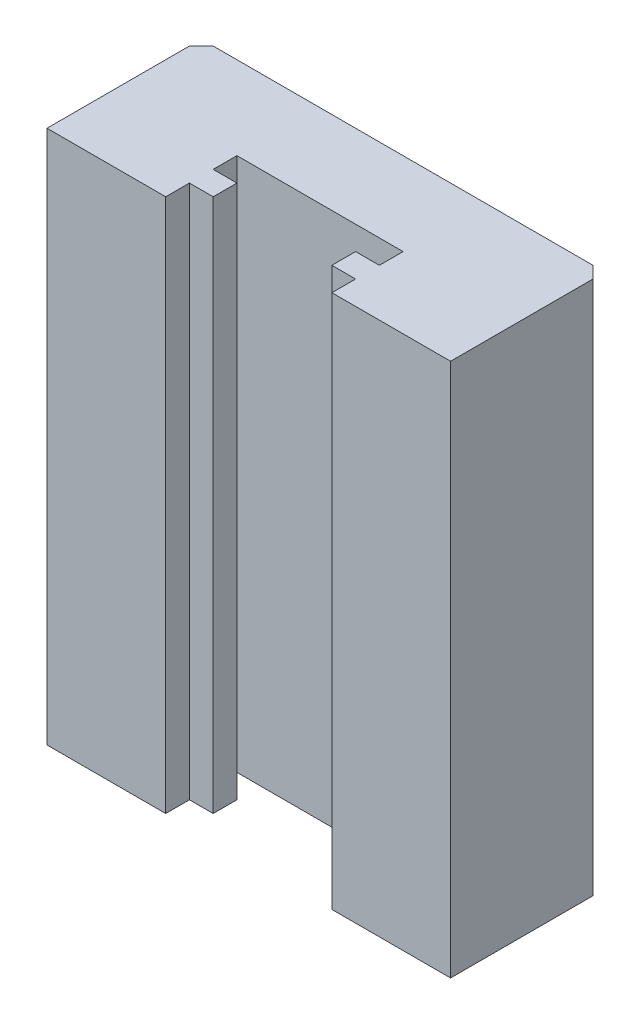
ISO-10303-21;
HEADER;
FILE_DESCRIPTION(('STEP AP214'),'2;1');
FILE_NAME('part.step','',(''),(''),'','','');
FILE_SCHEMA(('AUTOMOTIVE_DESIGN { 1 0 10303 214 1 1 1 1 }'));
ENDSEC;
DATA;
#1=APPLICATION_CONTEXT('core data for automotive mechanical design processes');
#2=APPLICATION_PROTOCOL_DEFINITION('international standard','automotive_design',2000,#1);
#3=PRODUCT_CONTEXT('',#1,'mechanical');
#4=PRODUCT('Part','Part','',(#3));
#5=PRODUCT_RELATED_PRODUCT_CATEGORY('part','',(#4));
#6=PRODUCT_DEFINITION_FORMATION('','',#4);
#7=PRODUCT_DEFINITION_CONTEXT('part definition',#1,'design');
#8=PRODUCT_DEFINITION('design','',#6,#7);
#9=PRODUCT_DEFINITION_SHAPE('','',#8);
#10=(LENGTH_UNIT() NAMED_UNIT(*) SI_UNIT(.MILLI.,.METRE.));
#11=(NAMED_UNIT(*) PLANE_ANGLE_UNIT() SI_UNIT($,.RADIAN.));
#12=(NAMED_UNIT(*) SI_UNIT($,.STERADIAN.) SOLID_ANGLE_UNIT());
#13=UNCERTAINTY_MEASURE_WITH_UNIT(LENGTH_MEASURE(1.E-05),#10,'distance_accuracy_value','');
#14=(GEOMETRIC_REPRESENTATION_CONTEXT(3) GLOBAL_UNCERTAINTY_ASSIGNED_CONTEXT((#13)) GLOBAL_UNIT_ASSIGNED_CONTEXT((#10,
#11,#12)) REPRESENTATION_CONTEXT('',''));
#15=CARTESIAN_POINT('',(0.,0.,0.));
#16=DIRECTION('',(0.,0.,1.));
#17=DIRECTION('',(1.,0.,0.));
#18=AXIS2_PLACEMENT_3D('',#15,#16,#17);
#19=CARTESIAN_POINT('',(0.,22.5,3.25));
#20=DIRECTION('',(0.,0.,-1.));
#21=DIRECTION('',(-1.,0.,0.));
#22=AXIS2_PLACEMENT_3D('',#19,#20,#21);
#23=PLANE('',#22);
#24=DIRECTION('',(1.,0.,0.));
#25=VECTOR('',#24,1.);
#26=CARTESIAN_POINT('',(0.,0.,3.25));
#27=LINE('',#26,#25);
#28=CARTESIAN_POINT('',(-8.5,0.,3.25));
#29=VERTEX_POINT('',#28);
#30=CARTESIAN_POINT('',(-3.5,0.,3.25));
#31=VERTEX_POINT('',#30);
#32=EDGE_CURVE('E195',#29,#31,#27,.T.);
#33=ORIENTED_EDGE('',*,*,#32,.T.);
#34=DIRECTION('',(0.,-1.,0.));
#35=VECTOR('',#34,1.);
#36=CARTESIAN_POINT('',(-3.5,22.5,3.25));
#37=LINE('',#36,#35);
#38=CARTESIAN_POINT('',(-3.5,22.5,3.25));
#39=VERTEX_POINT('',#38);
#40=EDGE_CURVE('E179',#39,#31,#37,.T.);
#41=ORIENTED_EDGE('',*,*,#40,.F.);
#42=DIRECTION('',(1.,0.,0.));
#43=VECTOR('',#42,1.);
#44=CARTESIAN_POINT('',(0.,22.5,3.25));
#45=LINE('',#44,#43);
#46=CARTESIAN_POINT('',(-8.5,22.5,3.25));
#47=VERTEX_POINT('',#46);
#48=EDGE_CURVE('E185',#47,#39,#45,.T.);
#49=ORIENTED_EDGE('',*,*,#48,.F.);
#50=DIRECTION('',(0.,-1.,0.));
#51=VECTOR('',#50,1.);
#52=CARTESIAN_POINT('',(-8.5,22.5,3.25));
#53=LINE('',#52,#51);
#54=EDGE_CURVE('E244',#47,#29,#53,.T.);
#55=ORIENTED_EDGE('',*,*,#54,.T.);
#56=EDGE_LOOP('',(#33,#41,#49,#55));
#57=FACE_BOUND('',#56,.T.);
#58=ADVANCED_FACE('F45',(#57),#23,.F.);
#59=CARTESIAN_POINT('',(-3.5,22.5,0.));
#60=DIRECTION('',(-1.,0.,0.));
#61=DIRECTION('',(0.,0.,1.));
#62=AXIS2_PLACEMENT_3D('',#59,#60,#61);
#63=PLANE('',#62);
#64=DIRECTION('',(0.,0.,-1.));
#65=VECTOR('',#64,1.);
#66=CARTESIAN_POINT('',(-3.5,0.,0.));
#67=LINE('',#66,#65);
#68=CARTESIAN_POINT('',(-3.5,0.,2.25));
#69=VERTEX_POINT('',#68);
#70=EDGE_CURVE('E284',#31,#69,#67,.T.);
#71=ORIENTED_EDGE('',*,*,#70,.T.);
#72=DIRECTION('',(0.,-1.,0.));
#73=VECTOR('',#72,1.);
#74=CARTESIAN_POINT('',(-3.5,22.5,2.25));
#75=LINE('',#74,#73);
#76=CARTESIAN_POINT('',(-3.5,22.5,2.25));
#77=VERTEX_POINT('',#76);
#78=EDGE_CURVE('E182',#77,#69,#75,.T.);
#79=ORIENTED_EDGE('',*,*,#78,.F.);
#80=DIRECTION('',(0.,0.,-1.));
#81=VECTOR('',#80,1.);
#82=CARTESIAN_POINT('',(-3.5,22.5,0.));
#83=LINE('',#82,#81);
#84=EDGE_CURVE('E175',#39,#77,#83,.T.);
#85=ORIENTED_EDGE('',*,*,#84,.F.);
#86=ORIENTED_EDGE('',*,*,#40,.T.);
#87=EDGE_LOOP('',(#71,#79,#85,#86));
#88=FACE_BOUND('',#87,.T.);
#89=ADVANCED_FACE('F177',(#88),#63,.F.);
#90=CARTESIAN_POINT('',(0.,22.5,2.25));
#91=DIRECTION('',(0.,0.,-1.));
#92=DIRECTION('',(-1.,0.,0.));
#93=AXIS2_PLACEMENT_3D('',#90,#91,#92);
#94=PLANE('',#93);
#95=DIRECTION('',(1.,0.,0.));
#96=VECTOR('',#95,1.);
#97=CARTESIAN_POINT('',(0.,0.,2.25));
#98=LINE('',#97,#96);
#99=CARTESIAN_POINT('',(-2.5,0.,2.25));
#100=VERTEX_POINT('',#99);
#101=EDGE_CURVE('E278',#69,#100,#98,.T.);
#102=ORIENTED_EDGE('',*,*,#101,.T.);
#103=DIRECTION('',(0.,-1.,0.));
#104=VECTOR('',#103,1.);
#105=CARTESIAN_POINT('',(-2.5,22.5,2.25));
#106=LINE('',#105,#104);
#107=CARTESIAN_POINT('',(-2.5,22.5,2.25));
#108=VERTEX_POINT('',#107);
#109=EDGE_CURVE('E200',#108,#100,#106,.T.);
#110=ORIENTED_EDGE('',*,*,#109,.F.);
#111=DIRECTION('',(1.,0.,0.));
#112=VECTOR('',#111,1.);
#113=CARTESIAN_POINT('',(0.,22.5,2.25));
#114=LINE('',#113,#112);
#115=EDGE_CURVE('E184',#77,#108,#114,.T.);
#116=ORIENTED_EDGE('',*,*,#115,.F.);
#117=ORIENTED_EDGE('',*,*,#78,.T.);
#118=EDGE_LOOP('',(#102,#110,#116,#117));
#119=FACE_BOUND('',#118,.T.);
#120=ADVANCED_FACE('F364',(#119),#94,.F.);
#121=CARTESIAN_POINT('',(-2.5,22.5,0.));
#122=DIRECTION('',(-1.,0.,0.));
#123=DIRECTION('',(0.,0.,1.));
#124=AXIS2_PLACEMENT_3D('',#121,#122,#123);
#125=PLANE('',#124);
#126=DIRECTION('',(0.,0.,-1.));
#127=VECTOR('',#126,1.);
#128=CARTESIAN_POINT('',(-2.5,0.,0.));
#129=LINE('',#128,#127);
#130=CARTESIAN_POINT('',(-2.5,0.,1.25));
#131=VERTEX_POINT('',#130);
#132=EDGE_CURVE('E273',#100,#131,#129,.T.);
#133=ORIENTED_EDGE('',*,*,#132,.T.);
#134=DIRECTION('',(0.,-1.,0.));
#135=VECTOR('',#134,1.);
#136=CARTESIAN_POINT('',(-2.5,22.5,1.25));
#137=LINE('',#136,#135);
#138=CARTESIAN_POINT('',(-2.5,22.5,1.25));
#139=VERTEX_POINT('',#138);
#140=EDGE_CURVE('E264',#139,#131,#137,.T.);
#141=ORIENTED_EDGE('',*,*,#140,.F.);
#142=DIRECTION('',(0.,0.,-1.));
#143=VECTOR('',#142,1.);
#144=CARTESIAN_POINT('',(-2.5,22.5,0.));
#145=LINE('',#144,#143);
#146=EDGE_CURVE('E274',#108,#139,#145,.T.);
#147=ORIENTED_EDGE('',*,*,#146,.F.);
#148=ORIENTED_EDGE('',*,*,#109,.T.);
#149=EDGE_LOOP('',(#133,#141,#147,#148));
#150=FACE_BOUND('',#149,.T.);
#151=ADVANCED_FACE('F271',(#150),#125,.F.);
#152=CARTESIAN_POINT('',(0.,22.5,1.25));
#153=DIRECTION('',(0.,0.,1.));
#154=DIRECTION('',(1.,0.,0.));
#155=AXIS2_PLACEMENT_3D('',#152,#153,#154);
#156=PLANE('',#155);
#157=DIRECTION('',(-1.,0.,0.));
#158=VECTOR('',#157,1.);
#159=CARTESIAN_POINT('',(0.,0.,1.25));
#160=LINE('',#159,#158);
#161=CARTESIAN_POINT('',(-3.5,0.,1.25));
#162=VERTEX_POINT('',#161);
#163=EDGE_CURVE('E280',#131,#162,#160,.T.);
#164=ORIENTED_EDGE('',*,*,#163,.T.);
#165=DIRECTION('',(0.,-1.,0.));
#166=VECTOR('',#165,1.);
#167=CARTESIAN_POINT('',(-3.5,22.5,1.25));
#168=LINE('',#167,#166);
#169=CARTESIAN_POINT('',(-3.5,22.5,1.25));
#170=VERTEX_POINT('',#169);
#171=EDGE_CURVE('E261',#170,#162,#168,.T.);
#172=ORIENTED_EDGE('',*,*,#171,.F.);
#173=DIRECTION('',(-1.,0.,0.));
#174=VECTOR('',#173,1.);
#175=CARTESIAN_POINT('',(0.,22.5,1.25));
#176=LINE('',#175,#174);
#177=EDGE_CURVE('E348',#139,#170,#176,.T.);
#178=ORIENTED_EDGE('',*,*,#177,.F.);
#179=ORIENTED_EDGE('',*,*,#140,.T.);
#180=EDGE_LOOP('',(#164,#172,#178,#179));
#181=FACE_BOUND('',#180,.T.);
#182=ADVANCED_FACE('F347',(#181),#156,.F.);
#183=CARTESIAN_POINT('',(-3.5,22.5,0.));
#184=DIRECTION('',(-1.,0.,0.));
#185=DIRECTION('',(0.,0.,1.));
#186=AXIS2_PLACEMENT_3D('',#183,#184,#185);
#187=PLANE('',#186);
#188=DIRECTION('',(0.,0.,-1.));
#189=VECTOR('',#188,1.);
#190=CARTESIAN_POINT('',(-3.5,0.,0.));
#191=LINE('',#190,#189);
#192=CARTESIAN_POINT('',(-3.5,0.,0.25));
#193=VERTEX_POINT('',#192);
#194=EDGE_CURVE('E282',#162,#193,#191,.T.);
#195=ORIENTED_EDGE('',*,*,#194,.T.);
#196=DIRECTION('',(0.,-1.,0.));
#197=VECTOR('',#196,1.);
#198=CARTESIAN_POINT('',(-3.5,22.5,0.25));
#199=LINE('',#198,#197);
#200=CARTESIAN_POINT('',(-3.5,22.5,0.25));
#201=VERTEX_POINT('',#200);
#202=EDGE_CURVE('E259',#201,#193,#199,.T.);
#203=ORIENTED_EDGE('',*,*,#202,.F.);
#204=DIRECTION('',(0.,0.,-1.));
#205=VECTOR('',#204,1.);
#206=CARTESIAN_POINT('',(-3.5,22.5,0.));
#207=LINE('',#206,#205);
#208=EDGE_CURVE('E344',#170,#201,#207,.T.);
#209=ORIENTED_EDGE('',*,*,#208,.F.);
#210=ORIENTED_EDGE('',*,*,#171,.T.);
#211=EDGE_LOOP('',(#195,#203,#209,#210));
#212=FACE_BOUND('',#211,.T.);
#213=ADVANCED_FACE('F341',(#212),#187,.F.);
#214=CARTESIAN_POINT('',(0.,22.5,0.25));
#215=DIRECTION('',(0.,0.,1.));
#216=DIRECTION('',(1.,0.,0.));
#217=AXIS2_PLACEMENT_3D('',#214,#215,#216);
#218=PLANE('',#217);
#219=DIRECTION('',(-1.,0.,0.));
#220=VECTOR('',#219,1.);
#221=CARTESIAN_POINT('',(0.,0.,0.25));
#222=LINE('',#221,#220);
#223=CARTESIAN_POINT('',(3.5,0.,0.25));
#224=VERTEX_POINT('',#223);
#225=EDGE_CURVE('E290',#224,#193,#222,.T.);
#226=ORIENTED_EDGE('',*,*,#225,.F.);
#227=DIRECTION('',(0.,-1.,0.));
#228=VECTOR('',#227,1.);
#229=CARTESIAN_POINT('',(3.5,22.5,0.25));
#230=LINE('',#229,#228);
#231=CARTESIAN_POINT('',(3.5,22.5,0.25));
#232=VERTEX_POINT('',#231);
#233=EDGE_CURVE('E257',#232,#224,#230,.T.);
#234=ORIENTED_EDGE('',*,*,#233,.F.);
#235=DIRECTION('',(-1.,0.,0.));
#236=VECTOR('',#235,1.);
#237=CARTESIAN_POINT('',(0.,22.5,0.25));
#238=LINE('',#237,#236);
#239=EDGE_CURVE('E350',#232,#201,#238,.T.);
#240=ORIENTED_EDGE('',*,*,#239,.T.);
#241=ORIENTED_EDGE('',*,*,#202,.T.);
#242=EDGE_LOOP('',(#226,#234,#240,#241));
#243=FACE_BOUND('',#242,.T.);
#244=ADVANCED_FACE('F338',(#243),#218,.T.);
#245=CARTESIAN_POINT('',(3.5,22.5,0.));
#246=DIRECTION('',(-1.,0.,0.));
#247=DIRECTION('',(0.,0.,1.));
#248=AXIS2_PLACEMENT_3D('',#245,#246,#247);
#249=PLANE('',#248);
#250=DIRECTION('',(0.,0.,-1.));
#251=VECTOR('',#250,1.);
#252=CARTESIAN_POINT('',(3.5,0.,0.));
#253=LINE('',#252,#251);
#254=CARTESIAN_POINT('',(3.5,0.,1.25));
#255=VERTEX_POINT('',#254);
#256=EDGE_CURVE('E293',#255,#224,#253,.T.);
#257=ORIENTED_EDGE('',*,*,#256,.F.);
#258=DIRECTION('',(0.,-1.,0.));
#259=VECTOR('',#258,1.);
#260=CARTESIAN_POINT('',(3.5,22.5,1.25));
#261=LINE('',#260,#259);
#262=CARTESIAN_POINT('',(3.5,22.5,1.25));
#263=VERTEX_POINT('',#262);
#264=EDGE_CURVE('E255',#263,#255,#261,.T.);
#265=ORIENTED_EDGE('',*,*,#264,.F.);
#266=DIRECTION('',(0.,0.,-1.));
#267=VECTOR('',#266,1.);
#268=CARTESIAN_POINT('',(3.5,22.5,0.));
#269=LINE('',#268,#267);
#270=EDGE_CURVE('E334',#263,#232,#269,.T.);
#271=ORIENTED_EDGE('',*,*,#270,.T.);
#272=ORIENTED_EDGE('',*,*,#233,.T.);
#273=EDGE_LOOP('',(#257,#265,#271,#272));
#274=FACE_BOUND('',#273,.T.);
#275=ADVANCED_FACE('F332',(#274),#249,.T.);
#276=CARTESIAN_POINT('',(0.,22.5,1.25));
#277=DIRECTION('',(0.,0.,-1.));
#278=DIRECTION('',(-1.,0.,0.));
#279=AXIS2_PLACEMENT_3D('',#276,#277,#278);
#280=PLANE('',#279);
#281=DIRECTION('',(1.,0.,0.));
#282=VECTOR('',#281,1.);
#283=CARTESIAN_POINT('',(0.,0.,1.25));
#284=LINE('',#283,#282);
#285=CARTESIAN_POINT('',(2.5,0.,1.25));
#286=VERTEX_POINT('',#285);
#287=EDGE_CURVE('E296',#286,#255,#284,.T.);
#288=ORIENTED_EDGE('',*,*,#287,.F.);
#289=DIRECTION('',(0.,-1.,0.));
#290=VECTOR('',#289,1.);
#291=CARTESIAN_POINT('',(2.5,22.5,1.25));
#292=LINE('',#291,#290);
#293=CARTESIAN_POINT('',(2.5,22.5,1.25));
#294=VERTEX_POINT('',#293);
#295=EDGE_CURVE('E253',#294,#286,#292,.T.);
#296=ORIENTED_EDGE('',*,*,#295,.F.);
#297=DIRECTION('',(1.,0.,0.));
#298=VECTOR('',#297,1.);
#299=CARTESIAN_POINT('',(0.,22.5,1.25));
#300=LINE('',#299,#298);
#301=EDGE_CURVE('E328',#294,#263,#300,.T.);
#302=ORIENTED_EDGE('',*,*,#301,.T.);
#303=ORIENTED_EDGE('',*,*,#264,.T.);
#304=EDGE_LOOP('',(#288,#296,#302,#303));
#305=FACE_BOUND('',#304,.T.);
#306=ADVANCED_FACE('F325',(#305),#280,.T.);
#307=CARTESIAN_POINT('',(2.5,22.5,0.));
#308=DIRECTION('',(-1.,0.,0.));
#309=DIRECTION('',(0.,0.,1.));
#310=AXIS2_PLACEMENT_3D('',#307,#308,#309);
#311=PLANE('',#310);
#312=DIRECTION('',(0.,0.,-1.));
#313=VECTOR('',#312,1.);
#314=CARTESIAN_POINT('',(2.5,0.,0.));
#315=LINE('',#314,#313);
#316=CARTESIAN_POINT('',(2.5,0.,2.25));
#317=VERTEX_POINT('',#316);
#318=EDGE_CURVE('E299',#317,#286,#315,.T.);
#319=ORIENTED_EDGE('',*,*,#318,.F.);
#320=DIRECTION('',(0.,-1.,0.));
#321=VECTOR('',#320,1.);
#322=CARTESIAN_POINT('',(2.5,22.5,2.25));
#323=LINE('',#322,#321);
#324=CARTESIAN_POINT('',(2.5,22.5,2.25));
#325=VERTEX_POINT('',#324);
#326=EDGE_CURVE('E251',#325,#317,#323,.T.);
#327=ORIENTED_EDGE('',*,*,#326,.F.);
#328=DIRECTION('',(0.,0.,-1.));
#329=VECTOR('',#328,1.);
#330=CARTESIAN_POINT('',(2.5,22.5,0.));
#331=LINE('',#330,#329);
#332=EDGE_CURVE('E358',#325,#294,#331,.T.);
#333=ORIENTED_EDGE('',*,*,#332,.T.);
#334=ORIENTED_EDGE('',*,*,#295,.T.);
#335=EDGE_LOOP('',(#319,#327,#333,#334));
#336=FACE_BOUND('',#335,.T.);
#337=ADVANCED_FACE('F321',(#336),#311,.T.);
#338=CARTESIAN_POINT('',(0.,22.5,2.25));
#339=DIRECTION('',(0.,0.,1.));
#340=DIRECTION('',(1.,0.,0.));
#341=AXIS2_PLACEMENT_3D('',#338,#339,#340);
#342=PLANE('',#341);
#343=DIRECTION('',(-1.,0.,0.));
#344=VECTOR('',#343,1.);
#345=CARTESIAN_POINT('',(0.,0.,2.25));
#346=LINE('',#345,#344);
#347=CARTESIAN_POINT('',(3.5,0.,2.25));
#348=VERTEX_POINT('',#347);
#349=EDGE_CURVE('E301',#348,#317,#346,.T.);
#350=ORIENTED_EDGE('',*,*,#349,.F.);
#351=DIRECTION('',(0.,-1.,0.));
#352=VECTOR('',#351,1.);
#353=CARTESIAN_POINT('',(3.5,22.5,2.25));
#354=LINE('',#353,#352);
#355=CARTESIAN_POINT('',(3.5,22.5,2.25));
#356=VERTEX_POINT('',#355);
#357=EDGE_CURVE('E249',#356,#348,#354,.T.);
#358=ORIENTED_EDGE('',*,*,#357,.F.);
#359=DIRECTION('',(-1.,0.,0.));
#360=VECTOR('',#359,1.);
#361=CARTESIAN_POINT('',(0.,22.5,2.25));
#362=LINE('',#361,#360);
#363=EDGE_CURVE('E317',#356,#325,#362,.T.);
#364=ORIENTED_EDGE('',*,*,#363,.T.);
#365=ORIENTED_EDGE('',*,*,#326,.T.);
#366=EDGE_LOOP('',(#350,#358,#364,#365));
#367=FACE_BOUND('',#366,.T.);
#368=ADVANCED_FACE('F315',(#367),#342,.T.);
#369=CARTESIAN_POINT('',(3.5,22.5,0.));
#370=DIRECTION('',(-1.,0.,0.));
#371=DIRECTION('',(0.,0.,1.));
#372=AXIS2_PLACEMENT_3D('',#369,#370,#371);
#373=PLANE('',#372);
#374=DIRECTION('',(0.,0.,-1.));
#375=VECTOR('',#374,1.);
#376=CARTESIAN_POINT('',(3.5,0.,0.));
#377=LINE('',#376,#375);
#378=CARTESIAN_POINT('',(3.5,0.,3.25));
#379=VERTEX_POINT('',#378);
#380=EDGE_CURVE('E237',#379,#348,#377,.T.);
#381=ORIENTED_EDGE('',*,*,#380,.F.);
#382=DIRECTION('',(0.,-1.,0.));
#383=VECTOR('',#382,1.);
#384=CARTESIAN_POINT('',(3.5,22.5,3.25));
#385=LINE('',#384,#383);
#386=CARTESIAN_POINT('',(3.5,22.5,3.25));
#387=VERTEX_POINT('',#386);
#388=EDGE_CURVE('E247',#387,#379,#385,.T.);
#389=ORIENTED_EDGE('',*,*,#388,.F.);
#390=DIRECTION('',(0.,0.,-1.));
#391=VECTOR('',#390,1.);
#392=CARTESIAN_POINT('',(3.5,22.5,0.));
#393=LINE('',#392,#391);
#394=EDGE_CURVE('E311',#387,#356,#393,.T.);
#395=ORIENTED_EDGE('',*,*,#394,.T.);
#396=ORIENTED_EDGE('',*,*,#357,.T.);
#397=EDGE_LOOP('',(#381,#389,#395,#396));
#398=FACE_BOUND('',#397,.T.);
#399=ADVANCED_FACE('F307',(#398),#373,.T.);
#400=CARTESIAN_POINT('',(8.5,0.,3.25));
#401=VERTEX_POINT('',#400);
#402=EDGE_CURVE('E234',#379,#401,#27,.T.);
#403=ORIENTED_EDGE('',*,*,#402,.T.);
#404=DIRECTION('',(0.,-1.,0.));
#405=VECTOR('',#404,1.);
#406=CARTESIAN_POINT('',(8.5,22.5,3.25));
#407=LINE('',#406,#405);
#408=CARTESIAN_POINT('',(8.5,22.5,3.25));
#409=VERTEX_POINT('',#408);
#410=EDGE_CURVE('E233',#409,#401,#407,.T.);
#411=ORIENTED_EDGE('',*,*,#410,.F.);
#412=EDGE_CURVE('E193',#387,#409,#45,.T.);
#413=ORIENTED_EDGE('',*,*,#412,.F.);
#414=ORIENTED_EDGE('',*,*,#388,.T.);
#415=EDGE_LOOP('',(#403,#411,#413,#414));
#416=FACE_BOUND('',#415,.T.);
#417=ADVANCED_FACE('F416',(#416),#23,.F.);
#418=CARTESIAN_POINT('',(8.5,22.5,0.));
#419=DIRECTION('',(-1.,0.,0.));
#420=DIRECTION('',(0.,0.,1.));
#421=AXIS2_PLACEMENT_3D('',#418,#419,#420);
#422=PLANE('',#421);
#423=DIRECTION('',(0.,0.,-1.));
#424=VECTOR('',#423,1.);
#425=CARTESIAN_POINT('',(8.5,0.,0.));
#426=LINE('',#425,#424);
#427=CARTESIAN_POINT('',(8.5,0.,-2.75));
#428=VERTEX_POINT('',#427);
#429=EDGE_CURVE('E228',#401,#428,#426,.T.);
#430=ORIENTED_EDGE('',*,*,#429,.T.);
#431=DIRECTION('',(0.,1.,0.));
#432=VECTOR('',#431,1.);
#433=CARTESIAN_POINT('',(8.5,22.5,-2.75));
#434=LINE('',#433,#432);
#435=CARTESIAN_POINT('',(8.5,22.5,-2.75));
#436=VERTEX_POINT('',#435);
#437=EDGE_CURVE('E69',#428,#436,#434,.T.);
#438=ORIENTED_EDGE('',*,*,#437,.T.);
#439=DIRECTION('',(0.,0.,-1.));
#440=VECTOR('',#439,1.);
#441=CARTESIAN_POINT('',(8.5,22.5,0.));
#442=LINE('',#441,#440);
#443=EDGE_CURVE('E214',#409,#436,#442,.T.);
#444=ORIENTED_EDGE('',*,*,#443,.F.);
#445=ORIENTED_EDGE('',*,*,#410,.T.);
#446=EDGE_LOOP('',(#430,#438,#444,#445));
#447=FACE_BOUND('',#446,.T.);
#448=ADVANCED_FACE('F231',(#447),#422,.F.);
#449=CARTESIAN_POINT('',(0.,22.5,-3.25));
#450=DIRECTION('',(0.,0.,-1.));
#451=DIRECTION('',(-1.,0.,0.));
#452=AXIS2_PLACEMENT_3D('',#449,#450,#451);
#453=PLANE('',#452);
#454=CARTESIAN_POINT('',(6.,15.25,-3.25));
#455=DIRECTION('',(0.,0.,-1.));
#456=DIRECTION('',(1.,0.,0.));
#457=AXIS2_PLACEMENT_3D('',#454,#455,#456);
#458=CIRCLE('',#457,1.);
#459=CARTESIAN_POINT('',(7.,15.25,-3.25));
#460=VERTEX_POINT('',#459);
#461=EDGE_CURVE('E375',#460,#460,#458,.T.);
#462=ORIENTED_EDGE('',*,*,#461,.F.);
#463=EDGE_LOOP('',(#462));
#464=FACE_BOUND('',#463,.T.);
#465=CARTESIAN_POINT('',(6.,7.25,-3.25));
#466=DIRECTION('',(0.,0.,-1.));
#467=DIRECTION('',(-1.,0.,0.));
#468=AXIS2_PLACEMENT_3D('',#465,#466,#467);
#469=CIRCLE('',#468,1.);
#470=CARTESIAN_POINT('',(5.,7.25,-3.25));
#471=VERTEX_POINT('',#470);
#472=EDGE_CURVE('E381',#471,#471,#469,.T.);
#473=ORIENTED_EDGE('',*,*,#472,.F.);
#474=EDGE_LOOP('',(#473));
#475=FACE_BOUND('',#474,.T.);
#476=CARTESIAN_POINT('',(-6.,7.25,-3.25));
#477=DIRECTION('',(0.,0.,-1.));
#478=DIRECTION('',(1.,0.,0.));
#479=AXIS2_PLACEMENT_3D('',#476,#477,#478);
#480=CIRCLE('',#479,1.);
#481=CARTESIAN_POINT('',(-5.,7.25,-3.25));
#482=VERTEX_POINT('',#481);
#483=EDGE_CURVE('E369',#482,#482,#480,.T.);
#484=ORIENTED_EDGE('',*,*,#483,.F.);
#485=EDGE_LOOP('',(#484));
#486=FACE_BOUND('',#485,.T.);
#487=CARTESIAN_POINT('',(-6.,15.25,-3.25));
#488=DIRECTION('',(0.,0.,-1.));
#489=DIRECTION('',(-1.,0.,0.));
#490=AXIS2_PLACEMENT_3D('',#487,#488,#489);
#491=CIRCLE('',#490,1.);
#492=CARTESIAN_POINT('',(-7.,15.25,-3.25));
#493=VERTEX_POINT('',#492);
#494=EDGE_CURVE('E366',#493,#493,#491,.T.);
#495=ORIENTED_EDGE('',*,*,#494,.F.);
#496=EDGE_LOOP('',(#495));
#497=FACE_BOUND('',#496,.T.);
#498=DIRECTION('',(1.,0.,0.));
#499=VECTOR('',#498,1.);
#500=CARTESIAN_POINT('',(0.,22.5,-3.25));
#501=LINE('',#500,#499);
#502=CARTESIAN_POINT('',(-8.,22.5,-3.25));
#503=VERTEX_POINT('',#502);
#504=CARTESIAN_POINT('',(8.,22.5,-3.25));
#505=VERTEX_POINT('',#504);
#506=EDGE_CURVE('E213',#503,#505,#501,.T.);
#507=ORIENTED_EDGE('',*,*,#506,.T.);
#508=DIRECTION('',(0.,-1.,0.));
#509=VECTOR('',#508,1.);
#510=CARTESIAN_POINT('',(8.,0.,-3.25));
#511=LINE('',#510,#509);
#512=CARTESIAN_POINT('',(8.,0.,-3.25));
#513=VERTEX_POINT('',#512);
#514=EDGE_CURVE('E198',#505,#513,#511,.T.);
#515=ORIENTED_EDGE('',*,*,#514,.T.);
#516=DIRECTION('',(1.,0.,0.));
#517=VECTOR('',#516,1.);
#518=CARTESIAN_POINT('',(0.,0.,-3.25));
#519=LINE('',#518,#517);
#520=CARTESIAN_POINT('',(-8.,0.,-3.25));
#521=VERTEX_POINT('',#520);
#522=EDGE_CURVE('E229',#521,#513,#519,.T.);
#523=ORIENTED_EDGE('',*,*,#522,.F.);
#524=DIRECTION('',(0.,1.,0.));
#525=VECTOR('',#524,1.);
#526=CARTESIAN_POINT('',(-8.,22.5,-3.25));
#527=LINE('',#526,#525);
#528=EDGE_CURVE('E196',#521,#503,#527,.T.);
#529=ORIENTED_EDGE('',*,*,#528,.T.);
#530=EDGE_LOOP('',(#507,#515,#523,#529));
#531=FACE_BOUND('',#530,.T.);
#532=ADVANCED_FACE('F218',(#464,#475,#486,#497,#531),#453,.T.);
#533=CARTESIAN_POINT('',(-8.5,22.5,0.));
#534=DIRECTION('',(-1.,0.,0.));
#535=DIRECTION('',(0.,0.,1.));
#536=AXIS2_PLACEMENT_3D('',#533,#534,#535);
#537=PLANE('',#536);
#538=DIRECTION('',(0.,0.,-1.));
#539=VECTOR('',#538,1.);
#540=CARTESIAN_POINT('',(-8.5,22.5,0.));
#541=LINE('',#540,#539);
#542=CARTESIAN_POINT('',(-8.5,22.5,-2.75));
#543=VERTEX_POINT('',#542);
#544=EDGE_CURVE('E189',#47,#543,#541,.T.);
#545=ORIENTED_EDGE('',*,*,#544,.T.);
#546=DIRECTION('',(0.,-1.,0.));
#547=VECTOR('',#546,1.);
#548=CARTESIAN_POINT('',(-8.5,22.5,-2.75));
#549=LINE('',#548,#547);
#550=CARTESIAN_POINT('',(-8.5,0.,-2.75));
#551=VERTEX_POINT('',#550);
#552=EDGE_CURVE('E11',#543,#551,#549,.T.);
#553=ORIENTED_EDGE('',*,*,#552,.T.);
#554=DIRECTION('',(0.,0.,-1.));
#555=VECTOR('',#554,1.);
#556=CARTESIAN_POINT('',(-8.5,0.,0.));
#557=LINE('',#556,#555);
#558=EDGE_CURVE('E191',#29,#551,#557,.T.);
#559=ORIENTED_EDGE('',*,*,#558,.F.);
#560=ORIENTED_EDGE('',*,*,#54,.F.);
#561=EDGE_LOOP('',(#545,#553,#559,#560));
#562=FACE_BOUND('',#561,.T.);
#563=ADVANCED_FACE('F394',(#562),#537,.T.);
#564=CARTESIAN_POINT('',(0.,22.5,0.));
#565=DIRECTION('',(0.,1.,0.));
#566=DIRECTION('',(0.,0.,1.));
#567=AXIS2_PLACEMENT_3D('',#564,#565,#566);
#568=PLANE('',#567);
#569=ORIENTED_EDGE('',*,*,#443,.T.);
#570=DIRECTION('',(-0.707106781186549,0.,-0.707106781186546));
#571=VECTOR('',#570,1.);
#572=CARTESIAN_POINT('',(5.62499999999999,22.5,-5.62500000000001));
#573=LINE('',#572,#571);
#574=EDGE_CURVE('E54',#436,#505,#573,.T.);
#575=ORIENTED_EDGE('',*,*,#574,.T.);
#576=ORIENTED_EDGE('',*,*,#506,.F.);
#577=DIRECTION('',(0.707106781186549,0.,-0.707106781186546));
#578=VECTOR('',#577,1.);
#579=CARTESIAN_POINT('',(-5.62499999999999,22.5,-5.62500000000001));
#580=LINE('',#579,#578);
#581=EDGE_CURVE('E61',#503,#543,#580,.F.);
#582=ORIENTED_EDGE('',*,*,#581,.T.);
#583=ORIENTED_EDGE('',*,*,#544,.F.);
#584=ORIENTED_EDGE('',*,*,#48,.T.);
#585=ORIENTED_EDGE('',*,*,#84,.T.);
#586=ORIENTED_EDGE('',*,*,#115,.T.);
#587=ORIENTED_EDGE('',*,*,#146,.T.);
#588=ORIENTED_EDGE('',*,*,#177,.T.);
#589=ORIENTED_EDGE('',*,*,#208,.T.);
#590=ORIENTED_EDGE('',*,*,#239,.F.);
#591=ORIENTED_EDGE('',*,*,#270,.F.);
#592=ORIENTED_EDGE('',*,*,#301,.F.);
#593=ORIENTED_EDGE('',*,*,#332,.F.);
#594=ORIENTED_EDGE('',*,*,#363,.F.);
#595=ORIENTED_EDGE('',*,*,#394,.F.);
#596=ORIENTED_EDGE('',*,*,#412,.T.);
#597=EDGE_LOOP('',(#569,#575,#576,#582,#583,#584,#585,#586,#587,#588,#589,#590,#591,#592,#593,
#594,#595,#596));
#598=FACE_BOUND('',#597,.T.);
#599=ADVANCED_FACE('F188',(#598),#568,.T.);
#600=CARTESIAN_POINT('',(0.,0.,0.));
#601=DIRECTION('',(0.,1.,0.));
#602=DIRECTION('',(0.,0.,1.));
#603=AXIS2_PLACEMENT_3D('',#600,#601,#602);
#604=PLANE('',#603);
#605=ORIENTED_EDGE('',*,*,#522,.T.);
#606=DIRECTION('',(0.707106781186549,0.,0.707106781186546));
#607=VECTOR('',#606,1.);
#608=CARTESIAN_POINT('',(8.,0.,-3.25));
#609=LINE('',#608,#607);
#610=EDGE_CURVE('E208',#513,#428,#609,.T.);
#611=ORIENTED_EDGE('',*,*,#610,.T.);
#612=ORIENTED_EDGE('',*,*,#429,.F.);
#613=ORIENTED_EDGE('',*,*,#402,.F.);
#614=ORIENTED_EDGE('',*,*,#380,.T.);
#615=ORIENTED_EDGE('',*,*,#349,.T.);
#616=ORIENTED_EDGE('',*,*,#318,.T.);
#617=ORIENTED_EDGE('',*,*,#287,.T.);
#618=ORIENTED_EDGE('',*,*,#256,.T.);
#619=ORIENTED_EDGE('',*,*,#225,.T.);
#620=ORIENTED_EDGE('',*,*,#194,.F.);
#621=ORIENTED_EDGE('',*,*,#163,.F.);
#622=ORIENTED_EDGE('',*,*,#132,.F.);
#623=ORIENTED_EDGE('',*,*,#101,.F.);
#624=ORIENTED_EDGE('',*,*,#70,.F.);
#625=ORIENTED_EDGE('',*,*,#32,.F.);
#626=ORIENTED_EDGE('',*,*,#558,.T.);
#627=DIRECTION('',(-0.707106781186549,0.,0.707106781186546));
#628=VECTOR('',#627,1.);
#629=CARTESIAN_POINT('',(-8.5,0.,-2.75));
#630=LINE('',#629,#628);
#631=EDGE_CURVE('E206',#551,#521,#630,.F.);
#632=ORIENTED_EDGE('',*,*,#631,.T.);
#633=EDGE_LOOP('',(#605,#611,#612,#613,#614,#615,#616,#617,#618,#619,#620,#621,#622,#623,#624,
#625,#626,#632));
#634=FACE_BOUND('',#633,.T.);
#635=ADVANCED_FACE('F226',(#634),#604,.F.);
#636=CARTESIAN_POINT('',(-6.,15.25,0.75));
#637=DIRECTION('',(0.,0.,-1.));
#638=DIRECTION('',(-1.,0.,0.));
#639=AXIS2_PLACEMENT_3D('',#636,#637,#638);
#640=CYLINDRICAL_SURFACE('',#639,1.);
#641=CARTESIAN_POINT('',(-6.,15.25,0.75));
#642=DIRECTION('',(0.,0.,-1.));
#643=DIRECTION('',(-1.,0.,0.));
#644=AXIS2_PLACEMENT_3D('',#641,#642,#643);
#645=CIRCLE('',#644,1.);
#646=CARTESIAN_POINT('',(-7.,15.25,0.75));
#647=VERTEX_POINT('',#646);
#648=EDGE_CURVE('E363',#647,#647,#645,.T.);
#649=ORIENTED_EDGE('',*,*,#648,.F.);
#650=EDGE_LOOP('',(#649));
#651=FACE_BOUND('',#650,.T.);
#652=ORIENTED_EDGE('',*,*,#494,.T.);
#653=EDGE_LOOP('',(#652));
#654=FACE_BOUND('',#653,.T.);
#655=ADVANCED_FACE('F399',(#651,#654),#640,.F.);
#656=CARTESIAN_POINT('',(-6.,15.25,0.75));
#657=DIRECTION('',(0.,0.,-1.));
#658=DIRECTION('',(-1.,0.,0.));
#659=AXIS2_PLACEMENT_3D('',#656,#657,#658);
#660=PLANE('',#659);
#661=ORIENTED_EDGE('',*,*,#648,.T.);
#662=EDGE_LOOP('',(#661));
#663=FACE_BOUND('',#662,.T.);
#664=ADVANCED_FACE('F401',(#663),#660,.T.);
#665=CARTESIAN_POINT('',(-6.,7.25,0.75));
#666=DIRECTION('',(0.,0.,-1.));
#667=DIRECTION('',(-1.,0.,0.));
#668=AXIS2_PLACEMENT_3D('',#665,#666,#667);
#669=CYLINDRICAL_SURFACE('',#668,1.);
#670=CARTESIAN_POINT('',(-6.,7.25,0.75));
#671=DIRECTION('',(0.,0.,-1.));
#672=DIRECTION('',(1.,0.,0.));
#673=AXIS2_PLACEMENT_3D('',#670,#671,#672);
#674=CIRCLE('',#673,1.);
#675=CARTESIAN_POINT('',(-5.,7.25,0.75));
#676=VERTEX_POINT('',#675);
#677=EDGE_CURVE('E384',#676,#676,#674,.T.);
#678=ORIENTED_EDGE('',*,*,#677,.F.);
#679=EDGE_LOOP('',(#678));
#680=FACE_BOUND('',#679,.T.);
#681=ORIENTED_EDGE('',*,*,#483,.T.);
#682=EDGE_LOOP('',(#681));
#683=FACE_BOUND('',#682,.T.);
#684=ADVANCED_FACE('F390',(#680,#683),#669,.F.);
#685=CARTESIAN_POINT('',(-6.,7.25,0.75));
#686=DIRECTION('',(0.,0.,1.));
#687=DIRECTION('',(1.,0.,0.));
#688=AXIS2_PLACEMENT_3D('',#685,#686,#687);
#689=PLANE('',#688);
#690=ORIENTED_EDGE('',*,*,#677,.T.);
#691=EDGE_LOOP('',(#690));
#692=FACE_BOUND('',#691,.T.);
#693=ADVANCED_FACE('F474',(#692),#689,.F.);
#694=CARTESIAN_POINT('',(6.,7.25,0.75));
#695=DIRECTION('',(0.,0.,-1.));
#696=DIRECTION('',(-1.,0.,0.));
#697=AXIS2_PLACEMENT_3D('',#694,#695,#696);
#698=CYLINDRICAL_SURFACE('',#697,1.);
#699=CARTESIAN_POINT('',(6.,7.25,0.75));
#700=DIRECTION('',(0.,0.,-1.));
#701=DIRECTION('',(-1.,0.,0.));
#702=AXIS2_PLACEMENT_3D('',#699,#700,#701);
#703=CIRCLE('',#702,1.);
#704=CARTESIAN_POINT('',(5.,7.25,0.75));
#705=VERTEX_POINT('',#704);
#706=EDGE_CURVE('E378',#705,#705,#703,.T.);
#707=ORIENTED_EDGE('',*,*,#706,.F.);
#708=EDGE_LOOP('',(#707));
#709=FACE_BOUND('',#708,.T.);
#710=ORIENTED_EDGE('',*,*,#472,.T.);
#711=EDGE_LOOP('',(#710));
#712=FACE_BOUND('',#711,.T.);
#713=ADVANCED_FACE('F470',(#709,#712),#698,.F.);
#714=CARTESIAN_POINT('',(6.,7.25,0.75));
#715=DIRECTION('',(0.,0.,-1.));
#716=DIRECTION('',(-1.,0.,0.));
#717=AXIS2_PLACEMENT_3D('',#714,#715,#716);
#718=PLANE('',#717);
#719=ORIENTED_EDGE('',*,*,#706,.T.);
#720=EDGE_LOOP('',(#719));
#721=FACE_BOUND('',#720,.T.);
#722=ADVANCED_FACE('F464',(#721),#718,.T.);
#723=CARTESIAN_POINT('',(6.,15.25,0.75));
#724=DIRECTION('',(0.,0.,-1.));
#725=DIRECTION('',(-1.,0.,0.));
#726=AXIS2_PLACEMENT_3D('',#723,#724,#725);
#727=CYLINDRICAL_SURFACE('',#726,1.);
#728=CARTESIAN_POINT('',(6.,15.25,0.75));
#729=DIRECTION('',(0.,0.,-1.));
#730=DIRECTION('',(1.,0.,0.));
#731=AXIS2_PLACEMENT_3D('',#728,#729,#730);
#732=CIRCLE('',#731,1.);
#733=CARTESIAN_POINT('',(7.,15.25,0.75));
#734=VERTEX_POINT('',#733);
#735=EDGE_CURVE('E372',#734,#734,#732,.T.);
#736=ORIENTED_EDGE('',*,*,#735,.F.);
#737=EDGE_LOOP('',(#736));
#738=FACE_BOUND('',#737,.T.);
#739=ORIENTED_EDGE('',*,*,#461,.T.);
#740=EDGE_LOOP('',(#739));
#741=FACE_BOUND('',#740,.T.);
#742=ADVANCED_FACE('F458',(#738,#741),#727,.F.);
#743=CARTESIAN_POINT('',(6.,15.25,0.75));
#744=DIRECTION('',(0.,0.,1.));
#745=DIRECTION('',(1.,0.,0.));
#746=AXIS2_PLACEMENT_3D('',#743,#744,#745);
#747=PLANE('',#746);
#748=ORIENTED_EDGE('',*,*,#735,.T.);
#749=EDGE_LOOP('',(#748));
#750=FACE_BOUND('',#749,.T.);
#751=ADVANCED_FACE('F452',(#750),#747,.F.);
#752=CARTESIAN_POINT('',(8.,22.5,-3.25));
#753=DIRECTION('',(0.707106781186546,0.,-0.707106781186549));
#754=DIRECTION('',(0.,1.,0.));
#755=AXIS2_PLACEMENT_3D('',#752,#753,#754);
#756=PLANE('',#755);
#757=ORIENTED_EDGE('',*,*,#574,.F.);
#758=ORIENTED_EDGE('',*,*,#437,.F.);
#759=ORIENTED_EDGE('',*,*,#610,.F.);
#760=ORIENTED_EDGE('',*,*,#514,.F.);
#761=EDGE_LOOP('',(#757,#758,#759,#760));
#762=FACE_BOUND('',#761,.T.);
#763=ADVANCED_FACE('F223',(#762),#756,.T.);
#764=CARTESIAN_POINT('',(-8.5,22.5,-2.75));
#765=DIRECTION('',(0.707106781186546,0.,0.707106781186549));
#766=DIRECTION('',(0.,-1.,0.));
#767=AXIS2_PLACEMENT_3D('',#764,#765,#766);
#768=PLANE('',#767);
#769=ORIENTED_EDGE('',*,*,#581,.F.);
#770=ORIENTED_EDGE('',*,*,#528,.F.);
#771=ORIENTED_EDGE('',*,*,#631,.F.);
#772=ORIENTED_EDGE('',*,*,#552,.F.);
#773=EDGE_LOOP('',(#769,#770,#771,#772));
#774=FACE_BOUND('',#773,.T.);
#775=ADVANCED_FACE('F48',(#774),#768,.F.);
#776=CLOSED_SHELL('',(#58,#89,#120,#151,#182,#213,#244,#275,#306,#337,#368,#399,#417,#448,#532,
#563,#599,#635,#655,#664,#684,#693,#713,#722,#742,#751,#763,#775));
#777=MANIFOLD_SOLID_BREP('B2',#776);
#778=ADVANCED_BREP_SHAPE_REPRESENTATION('',(#18,#777),#14);
#779=SHAPE_DEFINITION_REPRESENTATION(#9,#778);
ENDSEC;
END-ISO-10303-21;
